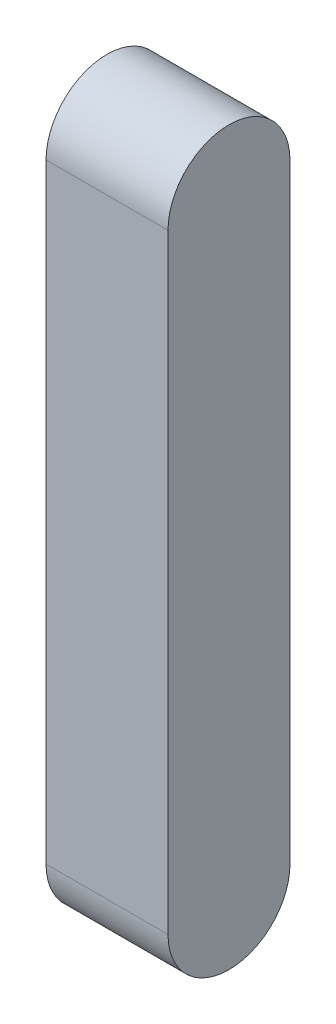
ISO-10303-21;
HEADER;
FILE_DESCRIPTION(('STEP AP214'),'2;1');
FILE_NAME('part.step','',(''),(''),'','','');
FILE_SCHEMA(('AUTOMOTIVE_DESIGN { 1 0 10303 214 1 1 1 1 }'));
ENDSEC;
DATA;
#1=APPLICATION_CONTEXT('core data for automotive mechanical design processes');
#2=APPLICATION_PROTOCOL_DEFINITION('international standard','automotive_design',2000,#1);
#3=PRODUCT_CONTEXT('',#1,'mechanical');
#4=PRODUCT('Part','Part','',(#3));
#5=PRODUCT_RELATED_PRODUCT_CATEGORY('part','',(#4));
#6=PRODUCT_DEFINITION_FORMATION('','',#4);
#7=PRODUCT_DEFINITION_CONTEXT('part definition',#1,'design');
#8=PRODUCT_DEFINITION('design','',#6,#7);
#9=PRODUCT_DEFINITION_SHAPE('','',#8);
#10=(LENGTH_UNIT() NAMED_UNIT(*) SI_UNIT(.MILLI.,.METRE.));
#11=(NAMED_UNIT(*) PLANE_ANGLE_UNIT() SI_UNIT($,.RADIAN.));
#12=(NAMED_UNIT(*) SI_UNIT($,.STERADIAN.) SOLID_ANGLE_UNIT());
#13=UNCERTAINTY_MEASURE_WITH_UNIT(LENGTH_MEASURE(1.E-05),#10,'distance_accuracy_value','');
#14=(GEOMETRIC_REPRESENTATION_CONTEXT(3) GLOBAL_UNCERTAINTY_ASSIGNED_CONTEXT((#13)) GLOBAL_UNIT_ASSIGNED_CONTEXT((#10,
#11,#12)) REPRESENTATION_CONTEXT('',''));
#15=CARTESIAN_POINT('',(0.,0.,0.));
#16=DIRECTION('',(0.,0.,1.));
#17=DIRECTION('',(1.,0.,0.));
#18=AXIS2_PLACEMENT_3D('',#15,#16,#17);
#19=CARTESIAN_POINT('',(10.,25.,5.00000000000001));
#20=DIRECTION('',(0.,0.,-1.));
#21=DIRECTION('',(0.,1.,0.));
#22=AXIS2_PLACEMENT_3D('',#19,#20,#21);
#23=PLANE('',#22);
#24=DIRECTION('',(0.,-1.,0.));
#25=VECTOR('',#24,1.);
#26=CARTESIAN_POINT('',(0.,25.,5.00000000000001));
#27=LINE('',#26,#25);
#28=CARTESIAN_POINT('',(0.,25.,5.00000000000001));
#29=VERTEX_POINT('',#28);
#30=CARTESIAN_POINT('',(0.,-25.0000000000001,5.));
#31=VERTEX_POINT('',#30);
#32=EDGE_CURVE('E135',#29,#31,#27,.T.);
#33=ORIENTED_EDGE('',*,*,#32,.T.);
#34=DIRECTION('',(-1.,0.,0.));
#35=VECTOR('',#34,1.);
#36=CARTESIAN_POINT('',(10.,-25.0000000000001,5.));
#37=LINE('',#36,#35);
#38=CARTESIAN_POINT('',(10.,-25.0000000000001,5.));
#39=VERTEX_POINT('',#38);
#40=EDGE_CURVE('E80',#39,#31,#37,.T.);
#41=ORIENTED_EDGE('',*,*,#40,.F.);
#42=DIRECTION('',(0.,-1.,0.));
#43=VECTOR('',#42,1.);
#44=CARTESIAN_POINT('',(10.,25.,5.00000000000001));
#45=LINE('',#44,#43);
#46=CARTESIAN_POINT('',(10.,25.,5.00000000000001));
#47=VERTEX_POINT('',#46);
#48=EDGE_CURVE('E129',#47,#39,#45,.T.);
#49=ORIENTED_EDGE('',*,*,#48,.F.);
#50=DIRECTION('',(-1.,0.,0.));
#51=VECTOR('',#50,1.);
#52=CARTESIAN_POINT('',(10.,25.,5.00000000000001));
#53=LINE('',#52,#51);
#54=EDGE_CURVE('E12',#47,#29,#53,.T.);
#55=ORIENTED_EDGE('',*,*,#54,.T.);
#56=EDGE_LOOP('',(#33,#41,#49,#55));
#57=FACE_BOUND('',#56,.T.);
#58=ADVANCED_FACE('F69',(#57),#23,.F.);
#59=CARTESIAN_POINT('',(10.,25.,-4.99999999999999));
#60=DIRECTION('',(0.,0.,-1.));
#61=DIRECTION('',(0.,1.,0.));
#62=AXIS2_PLACEMENT_3D('',#59,#60,#61);
#63=PLANE('',#62);
#64=DIRECTION('',(0.,-1.,0.));
#65=VECTOR('',#64,1.);
#66=CARTESIAN_POINT('',(0.,25.,-4.99999999999999));
#67=LINE('',#66,#65);
#68=CARTESIAN_POINT('',(0.,25.,-4.99999999999999));
#69=VERTEX_POINT('',#68);
#70=CARTESIAN_POINT('',(0.,-25.0000000000001,-5.));
#71=VERTEX_POINT('',#70);
#72=EDGE_CURVE('E131',#69,#71,#67,.T.);
#73=ORIENTED_EDGE('',*,*,#72,.F.);
#74=DIRECTION('',(-1.,0.,0.));
#75=VECTOR('',#74,1.);
#76=CARTESIAN_POINT('',(10.,25.,-4.99999999999999));
#77=LINE('',#76,#75);
#78=CARTESIAN_POINT('',(10.,25.,-4.99999999999999));
#79=VERTEX_POINT('',#78);
#80=EDGE_CURVE('E114',#79,#69,#77,.T.);
#81=ORIENTED_EDGE('',*,*,#80,.F.);
#82=DIRECTION('',(0.,-1.,0.));
#83=VECTOR('',#82,1.);
#84=CARTESIAN_POINT('',(10.,25.,-4.99999999999999));
#85=LINE('',#84,#83);
#86=CARTESIAN_POINT('',(10.,-25.0000000000001,-5.));
#87=VERTEX_POINT('',#86);
#88=EDGE_CURVE('E128',#79,#87,#85,.T.);
#89=ORIENTED_EDGE('',*,*,#88,.T.);
#90=DIRECTION('',(-1.,0.,0.));
#91=VECTOR('',#90,1.);
#92=CARTESIAN_POINT('',(10.,-25.0000000000001,-5.));
#93=LINE('',#92,#91);
#94=EDGE_CURVE('E116',#87,#71,#93,.T.);
#95=ORIENTED_EDGE('',*,*,#94,.T.);
#96=EDGE_LOOP('',(#73,#81,#89,#95));
#97=FACE_BOUND('',#96,.T.);
#98=ADVANCED_FACE('F133',(#97),#63,.T.);
#99=CARTESIAN_POINT('',(0.,0.,0.));
#100=DIRECTION('',(-1.,0.,0.));
#101=DIRECTION('',(0.,0.,1.));
#102=AXIS2_PLACEMENT_3D('',#99,#100,#101);
#103=PLANE('',#102);
#104=ORIENTED_EDGE('',*,*,#72,.T.);
#105=CARTESIAN_POINT('',(0.,-25.,0.));
#106=DIRECTION('',(1.,0.,0.));
#107=DIRECTION('',(0.,0.,-1.));
#108=AXIS2_PLACEMENT_3D('',#105,#106,#107);
#109=CIRCLE('',#108,5.);
#110=EDGE_CURVE('E121',#31,#71,#109,.T.);
#111=ORIENTED_EDGE('',*,*,#110,.F.);
#112=ORIENTED_EDGE('',*,*,#32,.F.);
#113=CARTESIAN_POINT('',(0.,25.,0.));
#114=DIRECTION('',(1.,0.,0.));
#115=DIRECTION('',(0.,0.,-1.));
#116=AXIS2_PLACEMENT_3D('',#113,#114,#115);
#117=CIRCLE('',#116,5.);
#118=EDGE_CURVE('E73',#69,#29,#117,.T.);
#119=ORIENTED_EDGE('',*,*,#118,.F.);
#120=EDGE_LOOP('',(#104,#111,#112,#119));
#121=FACE_BOUND('',#120,.T.);
#122=ADVANCED_FACE('F155',(#121),#103,.T.);
#123=CARTESIAN_POINT('',(10.,0.,0.));
#124=DIRECTION('',(-1.,0.,0.));
#125=DIRECTION('',(0.,0.,1.));
#126=AXIS2_PLACEMENT_3D('',#123,#124,#125);
#127=PLANE('',#126);
#128=ORIENTED_EDGE('',*,*,#48,.T.);
#129=CARTESIAN_POINT('',(10.,-25.,0.));
#130=DIRECTION('',(1.,0.,0.));
#131=DIRECTION('',(0.,0.,-1.));
#132=AXIS2_PLACEMENT_3D('',#129,#130,#131);
#133=CIRCLE('',#132,5.);
#134=EDGE_CURVE('E119',#39,#87,#133,.T.);
#135=ORIENTED_EDGE('',*,*,#134,.T.);
#136=ORIENTED_EDGE('',*,*,#88,.F.);
#137=CARTESIAN_POINT('',(10.,25.,0.));
#138=DIRECTION('',(1.,0.,0.));
#139=DIRECTION('',(0.,0.,-1.));
#140=AXIS2_PLACEMENT_3D('',#137,#138,#139);
#141=CIRCLE('',#140,5.);
#142=EDGE_CURVE('E149',#79,#47,#141,.T.);
#143=ORIENTED_EDGE('',*,*,#142,.T.);
#144=EDGE_LOOP('',(#128,#135,#136,#143));
#145=FACE_BOUND('',#144,.T.);
#146=ADVANCED_FACE('F127',(#145),#127,.F.);
#147=CARTESIAN_POINT('',(10.,25.,0.));
#148=DIRECTION('',(-1.,0.,0.));
#149=DIRECTION('',(0.,0.,1.));
#150=AXIS2_PLACEMENT_3D('',#147,#148,#149);
#151=CYLINDRICAL_SURFACE('',#150,5.);
#152=ORIENTED_EDGE('',*,*,#118,.T.);
#153=ORIENTED_EDGE('',*,*,#54,.F.);
#154=ORIENTED_EDGE('',*,*,#142,.F.);
#155=ORIENTED_EDGE('',*,*,#80,.T.);
#156=EDGE_LOOP('',(#152,#153,#154,#155));
#157=FACE_BOUND('',#156,.T.);
#158=ADVANCED_FACE('F71',(#157),#151,.T.);
#159=CARTESIAN_POINT('',(10.,-25.,0.));
#160=DIRECTION('',(-1.,0.,0.));
#161=DIRECTION('',(0.,0.,1.));
#162=AXIS2_PLACEMENT_3D('',#159,#160,#161);
#163=CYLINDRICAL_SURFACE('',#162,5.);
#164=ORIENTED_EDGE('',*,*,#134,.F.);
#165=ORIENTED_EDGE('',*,*,#40,.T.);
#166=ORIENTED_EDGE('',*,*,#110,.T.);
#167=ORIENTED_EDGE('',*,*,#94,.F.);
#168=EDGE_LOOP('',(#164,#165,#166,#167));
#169=FACE_BOUND('',#168,.T.);
#170=ADVANCED_FACE('F118',(#169),#163,.T.);
#171=CLOSED_SHELL('',(#58,#98,#122,#146,#158,#170));
#172=MANIFOLD_SOLID_BREP('B2',#171);
#173=ADVANCED_BREP_SHAPE_REPRESENTATION('',(#18,#172),#14);
#174=SHAPE_DEFINITION_REPRESENTATION(#9,#173);
ENDSEC;
END-ISO-10303-21;
